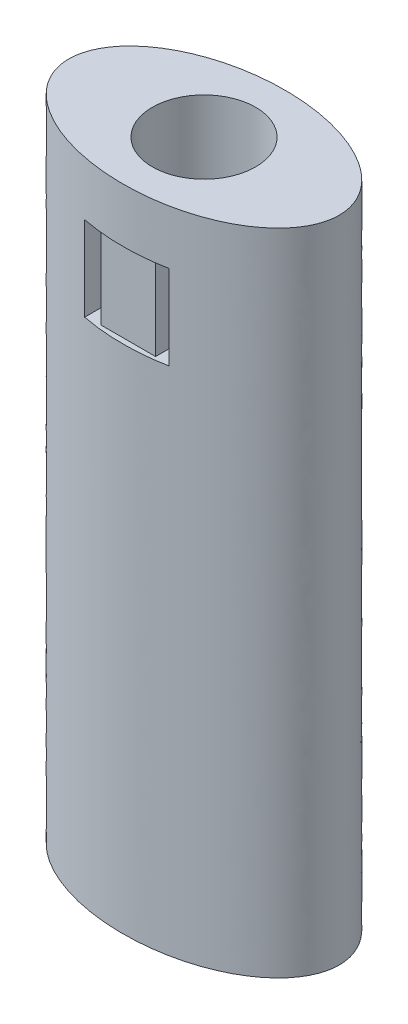
ISO-10303-21;
HEADER;
FILE_DESCRIPTION(('STEP AP214'),'2;1');
FILE_NAME('part.step','',(''),(''),'','','');
FILE_SCHEMA(('AUTOMOTIVE_DESIGN { 1 0 10303 214 1 1 1 1 }'));
ENDSEC;
DATA;
#1=APPLICATION_CONTEXT('core data for automotive mechanical design processes');
#2=APPLICATION_PROTOCOL_DEFINITION('international standard','automotive_design',2000,#1);
#3=PRODUCT_CONTEXT('',#1,'mechanical');
#4=PRODUCT('Part','Part','',(#3));
#5=PRODUCT_RELATED_PRODUCT_CATEGORY('part','',(#4));
#6=PRODUCT_DEFINITION_FORMATION('','',#4);
#7=PRODUCT_DEFINITION_CONTEXT('part definition',#1,'design');
#8=PRODUCT_DEFINITION('design','',#6,#7);
#9=PRODUCT_DEFINITION_SHAPE('','',#8);
#10=(LENGTH_UNIT() NAMED_UNIT(*) SI_UNIT(.MILLI.,.METRE.));
#11=(NAMED_UNIT(*) PLANE_ANGLE_UNIT() SI_UNIT($,.RADIAN.));
#12=(NAMED_UNIT(*) SI_UNIT($,.STERADIAN.) SOLID_ANGLE_UNIT());
#13=UNCERTAINTY_MEASURE_WITH_UNIT(LENGTH_MEASURE(1.E-05),#10,'distance_accuracy_value','');
#14=(GEOMETRIC_REPRESENTATION_CONTEXT(3) GLOBAL_UNCERTAINTY_ASSIGNED_CONTEXT((#13)) GLOBAL_UNIT_ASSIGNED_CONTEXT((#10,
#11,#12)) REPRESENTATION_CONTEXT('',''));
#15=CARTESIAN_POINT('',(0.,0.,0.));
#16=DIRECTION('',(0.,0.,1.));
#17=DIRECTION('',(1.,0.,0.));
#18=AXIS2_PLACEMENT_3D('',#15,#16,#17);
#19=CARTESIAN_POINT('',(0.,0.,14.));
#20=DIRECTION('',(0.,0.,-1.));
#21=DIRECTION('',(-1.,0.,0.));
#22=AXIS2_PLACEMENT_3D('',#19,#20,#21);
#23=PLANE('',#22);
#24=DIRECTION('',(0.,-1.,0.));
#25=VECTOR('',#24,1.);
#26=CARTESIAN_POINT('',(5.05,110.,14.));
#27=LINE('',#26,#25);
#28=CARTESIAN_POINT('',(5.05,110.,14.));
#29=VERTEX_POINT('',#28);
#30=CARTESIAN_POINT('',(5.05,94.4,14.));
#31=VERTEX_POINT('',#30);
#32=EDGE_CURVE('E145',#29,#31,#27,.T.);
#33=ORIENTED_EDGE('',*,*,#32,.F.);
#34=DIRECTION('',(-1.,0.,0.));
#35=VECTOR('',#34,1.);
#36=CARTESIAN_POINT('',(-7.80000000000001,110.,14.));
#37=LINE('',#36,#35);
#38=CARTESIAN_POINT('',(-5.05,110.,14.));
#39=VERTEX_POINT('',#38);
#40=EDGE_CURVE('E158',#29,#39,#37,.T.);
#41=ORIENTED_EDGE('',*,*,#40,.T.);
#42=DIRECTION('',(0.,1.,0.));
#43=VECTOR('',#42,1.);
#44=CARTESIAN_POINT('',(-5.05,110.,14.));
#45=LINE('',#44,#43);
#46=CARTESIAN_POINT('',(-5.05,94.4,14.));
#47=VERTEX_POINT('',#46);
#48=EDGE_CURVE('E148',#47,#39,#45,.T.);
#49=ORIENTED_EDGE('',*,*,#48,.F.);
#50=DIRECTION('',(1.,0.,0.));
#51=VECTOR('',#50,1.);
#52=CARTESIAN_POINT('',(-7.80000000000001,94.4,14.));
#53=LINE('',#52,#51);
#54=EDGE_CURVE('E187',#47,#31,#53,.T.);
#55=ORIENTED_EDGE('',*,*,#54,.T.);
#56=EDGE_LOOP('',(#33,#41,#49,#55));
#57=FACE_BOUND('',#56,.T.);
#58=ADVANCED_FACE('F47',(#57),#23,.F.);
#59=CARTESIAN_POINT('',(0.,120.,0.));
#60=DIRECTION('',(0.,1.,0.));
#61=DIRECTION('',(1.,0.,0.));
#62=AXIS2_PLACEMENT_3D('',#59,#60,#61);
#63=ELLIPSE('',#62,25.,15.);
#64=DIRECTION('',(0.,-1.,0.));
#65=VECTOR('',#64,1.);
#66=SURFACE_OF_LINEAR_EXTRUSION('',#63,#65);
#67=DIRECTION('',(0.,-1.,0.));
#68=VECTOR('',#67,1.);
#69=CARTESIAN_POINT('',(-7.80000000000001,120.,14.2512315257314));
#70=LINE('',#69,#68);
#71=CARTESIAN_POINT('',(-7.80000000000001,94.4,14.2512315257314));
#72=VERTEX_POINT('',#71);
#73=CARTESIAN_POINT('',(-7.80000000000001,110.,14.2512315257314));
#74=VERTEX_POINT('',#73);
#75=EDGE_CURVE('E12',#72,#74,#70,.F.);
#76=ORIENTED_EDGE('',*,*,#75,.T.);
#77=CARTESIAN_POINT('',(0.,110.,0.));
#78=DIRECTION('',(0.,1.,0.));
#79=DIRECTION('',(1.,0.,0.));
#80=AXIS2_PLACEMENT_3D('',#77,#78,#79);
#81=ELLIPSE('',#80,25.,15.);
#82=CARTESIAN_POINT('',(7.79999999999999,110.,14.2512315257314));
#83=VERTEX_POINT('',#82);
#84=EDGE_CURVE('E211',#74,#83,#81,.T.);
#85=ORIENTED_EDGE('',*,*,#84,.T.);
#86=DIRECTION('',(0.,-1.,0.));
#87=VECTOR('',#86,1.);
#88=CARTESIAN_POINT('',(7.79999999999998,120.,14.2512315257314));
#89=LINE('',#88,#87);
#90=CARTESIAN_POINT('',(7.79999999999999,94.4,14.2512315257314));
#91=VERTEX_POINT('',#90);
#92=EDGE_CURVE('E57',#83,#91,#89,.T.);
#93=ORIENTED_EDGE('',*,*,#92,.T.);
#94=CARTESIAN_POINT('',(0.,94.4,0.));
#95=DIRECTION('',(0.,1.,0.));
#96=DIRECTION('',(1.,0.,0.));
#97=AXIS2_PLACEMENT_3D('',#94,#95,#96);
#98=ELLIPSE('',#97,25.,15.);
#99=EDGE_CURVE('E124',#91,#72,#98,.F.);
#100=ORIENTED_EDGE('',*,*,#99,.T.);
#101=EDGE_LOOP('',(#76,#85,#93,#100));
#102=FACE_BOUND('',#101,.T.);
#103=CARTESIAN_POINT('',(25.,120.,0.));
#104=VERTEX_POINT('',#103);
#105=EDGE_CURVE('E206',#104,#104,#63,.T.);
#106=ORIENTED_EDGE('',*,*,#105,.F.);
#107=EDGE_LOOP('',(#106));
#108=FACE_BOUND('',#107,.T.);
#109=CARTESIAN_POINT('',(0.,0.,0.));
#110=DIRECTION('',(0.,1.,0.));
#111=DIRECTION('',(1.,0.,0.));
#112=AXIS2_PLACEMENT_3D('',#109,#110,#111);
#113=ELLIPSE('',#112,25.,15.);
#114=CARTESIAN_POINT('',(25.,0.,0.));
#115=VERTEX_POINT('',#114);
#116=EDGE_CURVE('E203',#115,#115,#113,.T.);
#117=ORIENTED_EDGE('',*,*,#116,.T.);
#118=EDGE_LOOP('',(#117));
#119=FACE_BOUND('',#118,.T.);
#120=ADVANCED_FACE('F49',(#102,#108,#119),#66,.F.);
#121=CARTESIAN_POINT('',(0.,120.,0.));
#122=DIRECTION('',(0.,1.,0.));
#123=DIRECTION('',(0.,0.,1.));
#124=AXIS2_PLACEMENT_3D('',#121,#122,#123);
#125=PLANE('',#124);
#126=CARTESIAN_POINT('',(0.,120.,0.));
#127=DIRECTION('',(0.,-1.,0.));
#128=DIRECTION('',(0.,0.,-1.));
#129=AXIS2_PLACEMENT_3D('',#126,#127,#128);
#130=CIRCLE('',#129,9.55);
#131=CARTESIAN_POINT('',(0.,120.,-9.55));
#132=VERTEX_POINT('',#131);
#133=EDGE_CURVE('E199',#132,#132,#130,.T.);
#134=ORIENTED_EDGE('',*,*,#133,.T.);
#135=EDGE_LOOP('',(#134));
#136=FACE_BOUND('',#135,.T.);
#137=ORIENTED_EDGE('',*,*,#105,.T.);
#138=EDGE_LOOP('',(#137));
#139=FACE_BOUND('',#138,.T.);
#140=ADVANCED_FACE('F251',(#136,#139),#125,.T.);
#141=CARTESIAN_POINT('',(0.,0.,0.));
#142=DIRECTION('',(0.,1.,0.));
#143=DIRECTION('',(0.,0.,1.));
#144=AXIS2_PLACEMENT_3D('',#141,#142,#143);
#145=PLANE('',#144);
#146=CARTESIAN_POINT('',(0.,0.,0.));
#147=DIRECTION('',(0.,-1.,0.));
#148=DIRECTION('',(0.,0.,-1.));
#149=AXIS2_PLACEMENT_3D('',#146,#147,#148);
#150=CIRCLE('',#149,9.55);
#151=CARTESIAN_POINT('',(0.,0.,-9.55));
#152=VERTEX_POINT('',#151);
#153=EDGE_CURVE('E129',#152,#152,#150,.T.);
#154=ORIENTED_EDGE('',*,*,#153,.F.);
#155=EDGE_LOOP('',(#154));
#156=FACE_BOUND('',#155,.T.);
#157=ORIENTED_EDGE('',*,*,#116,.F.);
#158=EDGE_LOOP('',(#157));
#159=FACE_BOUND('',#158,.T.);
#160=ADVANCED_FACE('F263',(#156,#159),#145,.F.);
#161=CARTESIAN_POINT('',(0.,120.,0.));
#162=DIRECTION('',(0.,-1.,0.));
#163=DIRECTION('',(0.,0.,-1.));
#164=AXIS2_PLACEMENT_3D('',#161,#162,#163);
#165=CYLINDRICAL_SURFACE('',#164,9.55);
#166=ORIENTED_EDGE('',*,*,#133,.F.);
#167=EDGE_LOOP('',(#166));
#168=FACE_BOUND('',#167,.T.);
#169=ORIENTED_EDGE('',*,*,#153,.T.);
#170=EDGE_LOOP('',(#169));
#171=FACE_BOUND('',#170,.T.);
#172=ADVANCED_FACE('F260',(#168,#171),#165,.F.);
#173=CARTESIAN_POINT('',(7.79999999999999,94.4,14.));
#174=DIRECTION('',(1.,0.,0.));
#175=DIRECTION('',(0.,0.,-1.));
#176=AXIS2_PLACEMENT_3D('',#173,#174,#175);
#177=PLANE('',#176);
#178=DIRECTION('',(0.,0.,1.));
#179=VECTOR('',#178,1.);
#180=CARTESIAN_POINT('',(7.79999999999999,110.,14.));
#181=LINE('',#180,#179);
#182=CARTESIAN_POINT('',(7.79999999999999,110.,11.));
#183=VERTEX_POINT('',#182);
#184=EDGE_CURVE('E135',#183,#83,#181,.T.);
#185=ORIENTED_EDGE('',*,*,#184,.F.);
#186=DIRECTION('',(0.,1.,0.));
#187=VECTOR('',#186,1.);
#188=CARTESIAN_POINT('',(7.79999999999999,110.,11.));
#189=LINE('',#188,#187);
#190=CARTESIAN_POINT('',(7.79999999999999,94.4,11.));
#191=VERTEX_POINT('',#190);
#192=EDGE_CURVE('E133',#191,#183,#189,.T.);
#193=ORIENTED_EDGE('',*,*,#192,.F.);
#194=DIRECTION('',(0.,0.,1.));
#195=VECTOR('',#194,1.);
#196=CARTESIAN_POINT('',(7.79999999999999,94.4,14.));
#197=LINE('',#196,#195);
#198=EDGE_CURVE('E116',#191,#91,#197,.T.);
#199=ORIENTED_EDGE('',*,*,#198,.T.);
#200=ORIENTED_EDGE('',*,*,#92,.F.);
#201=EDGE_LOOP('',(#185,#193,#199,#200));
#202=FACE_BOUND('',#201,.T.);
#203=ADVANCED_FACE('F134',(#202),#177,.F.);
#204=CARTESIAN_POINT('',(-7.80000000000001,94.4,14.));
#205=DIRECTION('',(0.,-1.,0.));
#206=DIRECTION('',(0.,0.,-1.));
#207=AXIS2_PLACEMENT_3D('',#204,#205,#206);
#208=PLANE('',#207);
#209=ORIENTED_EDGE('',*,*,#198,.F.);
#210=DIRECTION('',(1.,0.,0.));
#211=VECTOR('',#210,1.);
#212=CARTESIAN_POINT('',(5.05,94.4,11.));
#213=LINE('',#212,#211);
#214=CARTESIAN_POINT('',(5.05,94.4,11.));
#215=VERTEX_POINT('',#214);
#216=EDGE_CURVE('E120',#215,#191,#213,.T.);
#217=ORIENTED_EDGE('',*,*,#216,.F.);
#218=DIRECTION('',(0.,0.,1.));
#219=VECTOR('',#218,1.);
#220=CARTESIAN_POINT('',(5.05,94.4,11.));
#221=LINE('',#220,#219);
#222=EDGE_CURVE('E155',#215,#31,#221,.T.);
#223=ORIENTED_EDGE('',*,*,#222,.T.);
#224=ORIENTED_EDGE('',*,*,#54,.F.);
#225=DIRECTION('',(0.,0.,1.));
#226=VECTOR('',#225,1.);
#227=CARTESIAN_POINT('',(-5.05,94.4,11.));
#228=LINE('',#227,#226);
#229=CARTESIAN_POINT('',(-5.05,94.4,11.));
#230=VERTEX_POINT('',#229);
#231=EDGE_CURVE('E64',#230,#47,#228,.T.);
#232=ORIENTED_EDGE('',*,*,#231,.F.);
#233=DIRECTION('',(1.,0.,0.));
#234=VECTOR('',#233,1.);
#235=CARTESIAN_POINT('',(-7.80000000000001,94.4,11.));
#236=LINE('',#235,#234);
#237=CARTESIAN_POINT('',(-7.80000000000001,94.4,11.));
#238=VERTEX_POINT('',#237);
#239=EDGE_CURVE('E173',#238,#230,#236,.T.);
#240=ORIENTED_EDGE('',*,*,#239,.F.);
#241=DIRECTION('',(0.,0.,1.));
#242=VECTOR('',#241,1.);
#243=CARTESIAN_POINT('',(-7.80000000000001,94.4,14.));
#244=LINE('',#243,#242);
#245=EDGE_CURVE('E130',#238,#72,#244,.T.);
#246=ORIENTED_EDGE('',*,*,#245,.T.);
#247=ORIENTED_EDGE('',*,*,#99,.F.);
#248=EDGE_LOOP('',(#209,#217,#223,#224,#232,#240,#246,#247));
#249=FACE_BOUND('',#248,.T.);
#250=ADVANCED_FACE('F118',(#249),#208,.F.);
#251=CARTESIAN_POINT('',(-7.80000000000001,94.4,14.));
#252=DIRECTION('',(-1.,0.,0.));
#253=DIRECTION('',(0.,0.,1.));
#254=AXIS2_PLACEMENT_3D('',#251,#252,#253);
#255=PLANE('',#254);
#256=ORIENTED_EDGE('',*,*,#245,.F.);
#257=DIRECTION('',(0.,-1.,0.));
#258=VECTOR('',#257,1.);
#259=CARTESIAN_POINT('',(-7.80000000000001,110.,11.));
#260=LINE('',#259,#258);
#261=CARTESIAN_POINT('',(-7.80000000000001,110.,11.));
#262=VERTEX_POINT('',#261);
#263=EDGE_CURVE('E177',#262,#238,#260,.T.);
#264=ORIENTED_EDGE('',*,*,#263,.F.);
#265=DIRECTION('',(0.,0.,1.));
#266=VECTOR('',#265,1.);
#267=CARTESIAN_POINT('',(-7.80000000000001,110.,14.));
#268=LINE('',#267,#266);
#269=EDGE_CURVE('E193',#262,#74,#268,.T.);
#270=ORIENTED_EDGE('',*,*,#269,.T.);
#271=ORIENTED_EDGE('',*,*,#75,.F.);
#272=EDGE_LOOP('',(#256,#264,#270,#271));
#273=FACE_BOUND('',#272,.T.);
#274=ADVANCED_FACE('F227',(#273),#255,.F.);
#275=CARTESIAN_POINT('',(-7.80000000000001,110.,14.));
#276=DIRECTION('',(0.,1.,0.));
#277=DIRECTION('',(0.,0.,1.));
#278=AXIS2_PLACEMENT_3D('',#275,#276,#277);
#279=PLANE('',#278);
#280=ORIENTED_EDGE('',*,*,#269,.F.);
#281=DIRECTION('',(-1.,0.,0.));
#282=VECTOR('',#281,1.);
#283=CARTESIAN_POINT('',(-7.80000000000001,110.,11.));
#284=LINE('',#283,#282);
#285=CARTESIAN_POINT('',(-5.05,110.,11.));
#286=VERTEX_POINT('',#285);
#287=EDGE_CURVE('E169',#286,#262,#284,.T.);
#288=ORIENTED_EDGE('',*,*,#287,.F.);
#289=DIRECTION('',(0.,0.,1.));
#290=VECTOR('',#289,1.);
#291=CARTESIAN_POINT('',(-5.05,110.,11.));
#292=LINE('',#291,#290);
#293=EDGE_CURVE('E164',#286,#39,#292,.T.);
#294=ORIENTED_EDGE('',*,*,#293,.T.);
#295=ORIENTED_EDGE('',*,*,#40,.F.);
#296=DIRECTION('',(0.,0.,1.));
#297=VECTOR('',#296,1.);
#298=CARTESIAN_POINT('',(5.05,110.,11.));
#299=LINE('',#298,#297);
#300=CARTESIAN_POINT('',(5.05,110.,11.));
#301=VERTEX_POINT('',#300);
#302=EDGE_CURVE('E72',#301,#29,#299,.T.);
#303=ORIENTED_EDGE('',*,*,#302,.F.);
#304=DIRECTION('',(-1.,0.,0.));
#305=VECTOR('',#304,1.);
#306=CARTESIAN_POINT('',(5.05,110.,11.));
#307=LINE('',#306,#305);
#308=EDGE_CURVE('E140',#183,#301,#307,.T.);
#309=ORIENTED_EDGE('',*,*,#308,.F.);
#310=ORIENTED_EDGE('',*,*,#184,.T.);
#311=ORIENTED_EDGE('',*,*,#84,.F.);
#312=EDGE_LOOP('',(#280,#288,#294,#295,#303,#309,#310,#311));
#313=FACE_BOUND('',#312,.T.);
#314=ADVANCED_FACE('F223',(#313),#279,.F.);
#315=CARTESIAN_POINT('',(-5.05,110.,11.));
#316=DIRECTION('',(1.,0.,0.));
#317=DIRECTION('',(0.,1.,0.));
#318=AXIS2_PLACEMENT_3D('',#315,#316,#317);
#319=PLANE('',#318);
#320=ORIENTED_EDGE('',*,*,#48,.T.);
#321=ORIENTED_EDGE('',*,*,#293,.F.);
#322=DIRECTION('',(0.,1.,0.));
#323=VECTOR('',#322,1.);
#324=CARTESIAN_POINT('',(-5.05,110.,11.));
#325=LINE('',#324,#323);
#326=EDGE_CURVE('E163',#230,#286,#325,.T.);
#327=ORIENTED_EDGE('',*,*,#326,.F.);
#328=ORIENTED_EDGE('',*,*,#231,.T.);
#329=EDGE_LOOP('',(#320,#321,#327,#328));
#330=FACE_BOUND('',#329,.T.);
#331=ADVANCED_FACE('F232',(#330),#319,.F.);
#332=CARTESIAN_POINT('',(0.,0.,11.));
#333=DIRECTION('',(0.,0.,-1.));
#334=DIRECTION('',(-1.,0.,0.));
#335=AXIS2_PLACEMENT_3D('',#332,#333,#334);
#336=PLANE('',#335);
#337=ORIENTED_EDGE('',*,*,#287,.T.);
#338=ORIENTED_EDGE('',*,*,#263,.T.);
#339=ORIENTED_EDGE('',*,*,#239,.T.);
#340=ORIENTED_EDGE('',*,*,#326,.T.);
#341=EDGE_LOOP('',(#337,#338,#339,#340));
#342=FACE_BOUND('',#341,.T.);
#343=ADVANCED_FACE('F230',(#342),#336,.F.);
#344=CARTESIAN_POINT('',(5.05,110.,11.));
#345=DIRECTION('',(-1.,0.,0.));
#346=DIRECTION('',(0.,-1.,0.));
#347=AXIS2_PLACEMENT_3D('',#344,#345,#346);
#348=PLANE('',#347);
#349=ORIENTED_EDGE('',*,*,#32,.T.);
#350=ORIENTED_EDGE('',*,*,#222,.F.);
#351=DIRECTION('',(0.,-1.,0.));
#352=VECTOR('',#351,1.);
#353=CARTESIAN_POINT('',(5.05,110.,11.));
#354=LINE('',#353,#352);
#355=EDGE_CURVE('E143',#301,#215,#354,.T.);
#356=ORIENTED_EDGE('',*,*,#355,.F.);
#357=ORIENTED_EDGE('',*,*,#302,.T.);
#358=EDGE_LOOP('',(#349,#350,#356,#357));
#359=FACE_BOUND('',#358,.T.);
#360=ADVANCED_FACE('F235',(#359),#348,.F.);
#361=CARTESIAN_POINT('',(0.,0.,11.));
#362=DIRECTION('',(0.,0.,-1.));
#363=DIRECTION('',(-1.,0.,0.));
#364=AXIS2_PLACEMENT_3D('',#361,#362,#363);
#365=PLANE('',#364);
#366=ORIENTED_EDGE('',*,*,#216,.T.);
#367=ORIENTED_EDGE('',*,*,#192,.T.);
#368=ORIENTED_EDGE('',*,*,#308,.T.);
#369=ORIENTED_EDGE('',*,*,#355,.T.);
#370=EDGE_LOOP('',(#366,#367,#368,#369));
#371=FACE_BOUND('',#370,.T.);
#372=ADVANCED_FACE('F142',(#371),#365,.F.);
#373=CLOSED_SHELL('',(#58,#120,#140,#160,#172,#203,#250,#274,#314,#331,#343,#360,#372));
#374=MANIFOLD_SOLID_BREP('B2',#373);
#375=ADVANCED_BREP_SHAPE_REPRESENTATION('',(#18,#374),#14);
#376=SHAPE_DEFINITION_REPRESENTATION(#9,#375);
ENDSEC;
END-ISO-10303-21;
